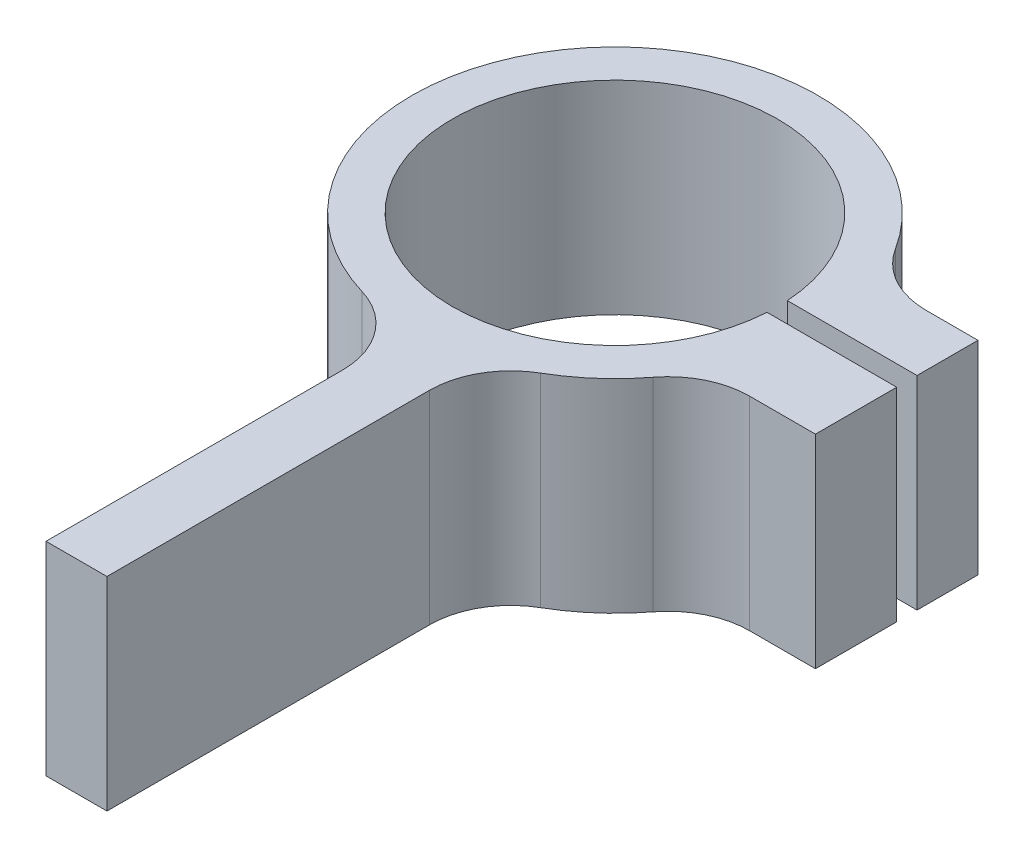
ISO-10303-21;
HEADER;
FILE_DESCRIPTION(('STEP AP214'),'2;1');
FILE_NAME('part.step','',(''),(''),'','','');
FILE_SCHEMA(('AUTOMOTIVE_DESIGN { 1 0 10303 214 1 1 1 1 }'));
ENDSEC;
DATA;
#1=APPLICATION_CONTEXT('core data for automotive mechanical design processes');
#2=APPLICATION_PROTOCOL_DEFINITION('international standard','automotive_design',2000,#1);
#3=PRODUCT_CONTEXT('',#1,'mechanical');
#4=PRODUCT('Part','Part','',(#3));
#5=PRODUCT_RELATED_PRODUCT_CATEGORY('part','',(#4));
#6=PRODUCT_DEFINITION_FORMATION('','',#4);
#7=PRODUCT_DEFINITION_CONTEXT('part definition',#1,'design');
#8=PRODUCT_DEFINITION('design','',#6,#7);
#9=PRODUCT_DEFINITION_SHAPE('','',#8);
#10=(LENGTH_UNIT() NAMED_UNIT(*) SI_UNIT(.MILLI.,.METRE.));
#11=(NAMED_UNIT(*) PLANE_ANGLE_UNIT() SI_UNIT($,.RADIAN.));
#12=(NAMED_UNIT(*) SI_UNIT($,.STERADIAN.) SOLID_ANGLE_UNIT());
#13=UNCERTAINTY_MEASURE_WITH_UNIT(LENGTH_MEASURE(1.E-05),#10,'distance_accuracy_value','');
#14=(GEOMETRIC_REPRESENTATION_CONTEXT(3) GLOBAL_UNCERTAINTY_ASSIGNED_CONTEXT((#13)) GLOBAL_UNIT_ASSIGNED_CONTEXT((#10,
#11,#12)) REPRESENTATION_CONTEXT('',''));
#15=CARTESIAN_POINT('',(0.,0.,0.));
#16=DIRECTION('',(0.,0.,1.));
#17=DIRECTION('',(1.,0.,0.));
#18=AXIS2_PLACEMENT_3D('',#15,#16,#17);
#19=CARTESIAN_POINT('',(14.3674969975976,10.,0.5));
#20=DIRECTION('',(-1.,0.,0.));
#21=DIRECTION('',(0.,0.,1.));
#22=AXIS2_PLACEMENT_3D('',#19,#20,#21);
#23=PLANE('',#22);
#24=DIRECTION('',(0.,0.,-1.));
#25=VECTOR('',#24,1.);
#26=CARTESIAN_POINT('',(14.3674969975976,0.,0.5));
#27=LINE('',#26,#25);
#28=CARTESIAN_POINT('',(14.3674969975976,0.,4.5));
#29=VERTEX_POINT('',#28);
#30=CARTESIAN_POINT('',(14.3674969975976,0.,0.5));
#31=VERTEX_POINT('',#30);
#32=EDGE_CURVE('E168',#29,#31,#27,.T.);
#33=ORIENTED_EDGE('',*,*,#32,.T.);
#34=DIRECTION('',(0.,-1.,0.));
#35=VECTOR('',#34,1.);
#36=CARTESIAN_POINT('',(14.3674969975976,10.,0.5));
#37=LINE('',#36,#35);
#38=CARTESIAN_POINT('',(14.3674969975976,10.,0.5));
#39=VERTEX_POINT('',#38);
#40=EDGE_CURVE('E150',#39,#31,#37,.T.);
#41=ORIENTED_EDGE('',*,*,#40,.F.);
#42=DIRECTION('',(0.,0.,-1.));
#43=VECTOR('',#42,1.);
#44=CARTESIAN_POINT('',(14.3674969975976,10.,0.5));
#45=LINE('',#44,#43);
#46=CARTESIAN_POINT('',(14.3674969975976,10.,4.5));
#47=VERTEX_POINT('',#46);
#48=EDGE_CURVE('E156',#47,#39,#45,.T.);
#49=ORIENTED_EDGE('',*,*,#48,.F.);
#50=DIRECTION('',(0.,-1.,0.));
#51=VECTOR('',#50,1.);
#52=CARTESIAN_POINT('',(14.3674969975976,10.,4.5));
#53=LINE('',#52,#51);
#54=EDGE_CURVE('E240',#47,#29,#53,.T.);
#55=ORIENTED_EDGE('',*,*,#54,.T.);
#56=EDGE_LOOP('',(#33,#41,#49,#55));
#57=FACE_BOUND('',#56,.T.);
#58=ADVANCED_FACE('F34',(#57),#23,.F.);
#59=CARTESIAN_POINT('',(7.98435971133566,10.,0.5));
#60=DIRECTION('',(0.,0.,1.));
#61=DIRECTION('',(1.,0.,0.));
#62=AXIS2_PLACEMENT_3D('',#59,#60,#61);
#63=PLANE('',#62);
#64=DIRECTION('',(-1.,0.,0.));
#65=VECTOR('',#64,1.);
#66=CARTESIAN_POINT('',(7.98435971133566,0.,0.5));
#67=LINE('',#66,#65);
#68=CARTESIAN_POINT('',(7.98435971133566,0.,0.5));
#69=VERTEX_POINT('',#68);
#70=EDGE_CURVE('E242',#31,#69,#67,.T.);
#71=ORIENTED_EDGE('',*,*,#70,.T.);
#72=DIRECTION('',(0.,-1.,0.));
#73=VECTOR('',#72,1.);
#74=CARTESIAN_POINT('',(7.98435971133566,10.,0.5));
#75=LINE('',#74,#73);
#76=CARTESIAN_POINT('',(7.98435971133566,10.,0.5));
#77=VERTEX_POINT('',#76);
#78=EDGE_CURVE('E153',#77,#69,#75,.T.);
#79=ORIENTED_EDGE('',*,*,#78,.F.);
#80=DIRECTION('',(-1.,0.,0.));
#81=VECTOR('',#80,1.);
#82=CARTESIAN_POINT('',(9.98749217771909,10.,0.5));
#83=LINE('',#82,#81);
#84=EDGE_CURVE('E146',#39,#77,#83,.T.);
#85=ORIENTED_EDGE('',*,*,#84,.F.);
#86=ORIENTED_EDGE('',*,*,#40,.T.);
#87=EDGE_LOOP('',(#71,#79,#85,#86));
#88=FACE_BOUND('',#87,.T.);
#89=ADVANCED_FACE('F148',(#88),#63,.F.);
#90=CARTESIAN_POINT('',(0.,10.,0.));
#91=DIRECTION('',(0.,-1.,0.));
#92=DIRECTION('',(0.,0.,-1.));
#93=AXIS2_PLACEMENT_3D('',#90,#91,#92);
#94=CYLINDRICAL_SURFACE('',#93,8.);
#95=CARTESIAN_POINT('',(0.,0.,0.));
#96=DIRECTION('',(0.,-1.,0.));
#97=DIRECTION('',(0.,0.,1.));
#98=AXIS2_PLACEMENT_3D('',#95,#96,#97);
#99=CIRCLE('',#98,8.);
#100=CARTESIAN_POINT('',(7.98435971133566,0.,-0.5));
#101=VERTEX_POINT('',#100);
#102=EDGE_CURVE('E244',#69,#101,#99,.T.);
#103=ORIENTED_EDGE('',*,*,#102,.T.);
#104=DIRECTION('',(0.,-1.,0.));
#105=VECTOR('',#104,1.);
#106=CARTESIAN_POINT('',(7.98435971133566,10.,-0.5));
#107=LINE('',#106,#105);
#108=CARTESIAN_POINT('',(7.98435971133566,10.,-0.5));
#109=VERTEX_POINT('',#108);
#110=EDGE_CURVE('E173',#109,#101,#107,.T.);
#111=ORIENTED_EDGE('',*,*,#110,.F.);
#112=CARTESIAN_POINT('',(0.,10.,0.));
#113=DIRECTION('',(0.,-1.,0.));
#114=DIRECTION('',(0.,0.,1.));
#115=AXIS2_PLACEMENT_3D('',#112,#113,#114);
#116=CIRCLE('',#115,8.);
#117=EDGE_CURVE('E155',#77,#109,#116,.T.);
#118=ORIENTED_EDGE('',*,*,#117,.F.);
#119=ORIENTED_EDGE('',*,*,#78,.T.);
#120=EDGE_LOOP('',(#103,#111,#118,#119));
#121=FACE_BOUND('',#120,.T.);
#122=ADVANCED_FACE('F281',(#121),#94,.F.);
#123=CARTESIAN_POINT('',(9.98749217771909,10.,-0.5));
#124=DIRECTION('',(0.,0.,-1.));
#125=DIRECTION('',(-1.,0.,0.));
#126=AXIS2_PLACEMENT_3D('',#123,#124,#125);
#127=PLANE('',#126);
#128=DIRECTION('',(1.,0.,0.));
#129=VECTOR('',#128,1.);
#130=CARTESIAN_POINT('',(9.98749217771909,0.,-0.5));
#131=LINE('',#130,#129);
#132=CARTESIAN_POINT('',(14.3674969975976,0.,-0.5));
#133=VERTEX_POINT('',#132);
#134=EDGE_CURVE('E247',#101,#133,#131,.T.);
#135=ORIENTED_EDGE('',*,*,#134,.T.);
#136=DIRECTION('',(0.,-1.,0.));
#137=VECTOR('',#136,1.);
#138=CARTESIAN_POINT('',(14.3674969975976,10.,-0.5));
#139=LINE('',#138,#137);
#140=CARTESIAN_POINT('',(14.3674969975976,10.,-0.5));
#141=VERTEX_POINT('',#140);
#142=EDGE_CURVE('E271',#141,#133,#139,.T.);
#143=ORIENTED_EDGE('',*,*,#142,.F.);
#144=DIRECTION('',(1.,0.,0.));
#145=VECTOR('',#144,1.);
#146=CARTESIAN_POINT('',(7.98435971133566,10.,-0.5));
#147=LINE('',#146,#145);
#148=EDGE_CURVE('E279',#109,#141,#147,.T.);
#149=ORIENTED_EDGE('',*,*,#148,.F.);
#150=ORIENTED_EDGE('',*,*,#110,.T.);
#151=EDGE_LOOP('',(#135,#143,#149,#150));
#152=FACE_BOUND('',#151,.T.);
#153=ADVANCED_FACE('F277',(#152),#127,.F.);
#154=CARTESIAN_POINT('',(14.3674969975976,10.,-0.5));
#155=DIRECTION('',(-1.,0.,0.));
#156=DIRECTION('',(0.,0.,1.));
#157=AXIS2_PLACEMENT_3D('',#154,#155,#156);
#158=PLANE('',#157);
#159=DIRECTION('',(0.,0.,-1.));
#160=VECTOR('',#159,1.);
#161=CARTESIAN_POINT('',(14.3674969975976,0.,-0.5));
#162=LINE('',#161,#160);
#163=CARTESIAN_POINT('',(14.3674969975976,0.,-3.5));
#164=VERTEX_POINT('',#163);
#165=EDGE_CURVE('E249',#133,#164,#162,.T.);
#166=ORIENTED_EDGE('',*,*,#165,.T.);
#167=DIRECTION('',(0.,-1.,0.));
#168=VECTOR('',#167,1.);
#169=CARTESIAN_POINT('',(14.3674969975976,10.,-3.5));
#170=LINE('',#169,#168);
#171=CARTESIAN_POINT('',(14.3674969975976,10.,-3.5));
#172=VERTEX_POINT('',#171);
#173=EDGE_CURVE('E268',#172,#164,#170,.T.);
#174=ORIENTED_EDGE('',*,*,#173,.F.);
#175=DIRECTION('',(0.,0.,-1.));
#176=VECTOR('',#175,1.);
#177=CARTESIAN_POINT('',(14.3674969975976,10.,-0.5));
#178=LINE('',#177,#176);
#179=EDGE_CURVE('E295',#141,#172,#178,.T.);
#180=ORIENTED_EDGE('',*,*,#179,.F.);
#181=ORIENTED_EDGE('',*,*,#142,.T.);
#182=EDGE_LOOP('',(#166,#174,#180,#181));
#183=FACE_BOUND('',#182,.T.);
#184=ADVANCED_FACE('F287',(#183),#158,.F.);
#185=CARTESIAN_POINT('',(14.3674969975976,10.,-3.5));
#186=DIRECTION('',(0.,0.,1.));
#187=DIRECTION('',(1.,0.,0.));
#188=AXIS2_PLACEMENT_3D('',#185,#186,#187);
#189=PLANE('',#188);
#190=DIRECTION('',(-1.,0.,0.));
#191=VECTOR('',#190,1.);
#192=CARTESIAN_POINT('',(14.3674969975976,0.,-3.5));
#193=LINE('',#192,#191);
#194=CARTESIAN_POINT('',(11.8215904175369,0.,-3.5));
#195=VERTEX_POINT('',#194);
#196=EDGE_CURVE('E216',#164,#195,#193,.T.);
#197=ORIENTED_EDGE('',*,*,#196,.T.);
#198=DIRECTION('',(0.,1.,0.));
#199=VECTOR('',#198,1.);
#200=CARTESIAN_POINT('',(11.8215904175369,10.,-3.5));
#201=LINE('',#200,#199);
#202=CARTESIAN_POINT('',(11.8215904175369,10.,-3.5));
#203=VERTEX_POINT('',#202);
#204=EDGE_CURVE('E179',#195,#203,#201,.T.);
#205=ORIENTED_EDGE('',*,*,#204,.T.);
#206=DIRECTION('',(-1.,0.,0.));
#207=VECTOR('',#206,1.);
#208=CARTESIAN_POINT('',(14.3674969975976,10.,-3.5));
#209=LINE('',#208,#207);
#210=EDGE_CURVE('E230',#172,#203,#209,.T.);
#211=ORIENTED_EDGE('',*,*,#210,.F.);
#212=ORIENTED_EDGE('',*,*,#173,.T.);
#213=EDGE_LOOP('',(#197,#205,#211,#212));
#214=FACE_BOUND('',#213,.T.);
#215=ADVANCED_FACE('F291',(#214),#189,.F.);
#216=CARTESIAN_POINT('',(0.,10.,0.));
#217=DIRECTION('',(0.,-1.,0.));
#218=DIRECTION('',(0.,0.,-1.));
#219=AXIS2_PLACEMENT_3D('',#216,#217,#218);
#220=CYLINDRICAL_SURFACE('',#219,10.);
#221=CARTESIAN_POINT('',(0.,10.,0.));
#222=DIRECTION('',(0.,1.,0.));
#223=DIRECTION('',(0.,0.,1.));
#224=AXIS2_PLACEMENT_3D('',#221,#222,#223);
#225=CIRCLE('',#224,10.);
#226=CARTESIAN_POINT('',(8.44399315538349,10.,-5.35714285714286));
#227=VERTEX_POINT('',#226);
#228=CARTESIAN_POINT('',(-2.85714285714286,10.,9.5831484749991));
#229=VERTEX_POINT('',#228);
#230=EDGE_CURVE('E226',#227,#229,#225,.T.);
#231=ORIENTED_EDGE('',*,*,#230,.F.);
#232=DIRECTION('',(0.,-1.,0.));
#233=VECTOR('',#232,1.);
#234=CARTESIAN_POINT('',(8.44399315538349,10.,-5.35714285714286));
#235=LINE('',#234,#233);
#236=CARTESIAN_POINT('',(8.44399315538349,0.,-5.35714285714286));
#237=VERTEX_POINT('',#236);
#238=EDGE_CURVE('E171',#227,#237,#235,.T.);
#239=ORIENTED_EDGE('',*,*,#238,.T.);
#240=CARTESIAN_POINT('',(0.,0.,0.));
#241=DIRECTION('',(0.,1.,0.));
#242=DIRECTION('',(0.,0.,1.));
#243=AXIS2_PLACEMENT_3D('',#240,#241,#242);
#244=CIRCLE('',#243,10.);
#245=CARTESIAN_POINT('',(-2.85714285714286,0.,9.5831484749991));
#246=VERTEX_POINT('',#245);
#247=EDGE_CURVE('E209',#237,#246,#244,.T.);
#248=ORIENTED_EDGE('',*,*,#247,.T.);
#249=DIRECTION('',(0.,-1.,0.));
#250=VECTOR('',#249,1.);
#251=CARTESIAN_POINT('',(-2.85714285714286,10.,9.5831484749991));
#252=LINE('',#251,#250);
#253=EDGE_CURVE('E169',#246,#229,#252,.F.);
#254=ORIENTED_EDGE('',*,*,#253,.T.);
#255=EDGE_LOOP('',(#231,#239,#248,#254));
#256=FACE_BOUND('',#255,.T.);
#257=ADVANCED_FACE('F214',(#256),#220,.T.);
#258=CARTESIAN_POINT('',(0.,10.,10.));
#259=DIRECTION('',(1.,0.,0.));
#260=DIRECTION('',(0.,0.,-1.));
#261=AXIS2_PLACEMENT_3D('',#258,#259,#260);
#262=PLANE('',#261);
#263=DIRECTION('',(0.,0.,1.));
#264=VECTOR('',#263,1.);
#265=CARTESIAN_POINT('',(0.,10.,10.));
#266=LINE('',#265,#264);
#267=CARTESIAN_POINT('',(0.,10.,13.4164078649987));
#268=VERTEX_POINT('',#267);
#269=CARTESIAN_POINT('',(0.,10.,28.));
#270=VERTEX_POINT('',#269);
#271=EDGE_CURVE('E222',#268,#270,#266,.T.);
#272=ORIENTED_EDGE('',*,*,#271,.F.);
#273=DIRECTION('',(0.,1.,0.));
#274=VECTOR('',#273,1.);
#275=CARTESIAN_POINT('',(0.,0.,13.4164078649987));
#276=LINE('',#275,#274);
#277=CARTESIAN_POINT('',(0.,0.,13.4164078649987));
#278=VERTEX_POINT('',#277);
#279=EDGE_CURVE('E191',#268,#278,#276,.F.);
#280=ORIENTED_EDGE('',*,*,#279,.T.);
#281=DIRECTION('',(0.,0.,1.));
#282=VECTOR('',#281,1.);
#283=CARTESIAN_POINT('',(0.,0.,10.));
#284=LINE('',#283,#282);
#285=CARTESIAN_POINT('',(0.,0.,28.));
#286=VERTEX_POINT('',#285);
#287=EDGE_CURVE('E211',#278,#286,#284,.T.);
#288=ORIENTED_EDGE('',*,*,#287,.T.);
#289=DIRECTION('',(0.,-1.,0.));
#290=VECTOR('',#289,1.);
#291=CARTESIAN_POINT('',(0.,10.,28.));
#292=LINE('',#291,#290);
#293=EDGE_CURVE('E223',#270,#286,#292,.T.);
#294=ORIENTED_EDGE('',*,*,#293,.F.);
#295=EDGE_LOOP('',(#272,#280,#288,#294));
#296=FACE_BOUND('',#295,.T.);
#297=ADVANCED_FACE('F219',(#296),#262,.F.);
#298=CARTESIAN_POINT('',(0.,10.,28.));
#299=DIRECTION('',(0.,0.,-1.));
#300=DIRECTION('',(-1.,0.,0.));
#301=AXIS2_PLACEMENT_3D('',#298,#299,#300);
#302=PLANE('',#301);
#303=DIRECTION('',(1.,0.,0.));
#304=VECTOR('',#303,1.);
#305=CARTESIAN_POINT('',(0.,0.,28.));
#306=LINE('',#305,#304);
#307=CARTESIAN_POINT('',(3.,0.,28.));
#308=VERTEX_POINT('',#307);
#309=EDGE_CURVE('E254',#286,#308,#306,.T.);
#310=ORIENTED_EDGE('',*,*,#309,.T.);
#311=DIRECTION('',(0.,-1.,0.));
#312=VECTOR('',#311,1.);
#313=CARTESIAN_POINT('',(3.,10.,28.));
#314=LINE('',#313,#312);
#315=CARTESIAN_POINT('',(3.,10.,28.));
#316=VERTEX_POINT('',#315);
#317=EDGE_CURVE('E264',#316,#308,#314,.T.);
#318=ORIENTED_EDGE('',*,*,#317,.F.);
#319=DIRECTION('',(1.,0.,0.));
#320=VECTOR('',#319,1.);
#321=CARTESIAN_POINT('',(0.,10.,28.));
#322=LINE('',#321,#320);
#323=EDGE_CURVE('E225',#270,#316,#322,.T.);
#324=ORIENTED_EDGE('',*,*,#323,.F.);
#325=ORIENTED_EDGE('',*,*,#293,.T.);
#326=EDGE_LOOP('',(#310,#318,#324,#325));
#327=FACE_BOUND('',#326,.T.);
#328=ADVANCED_FACE('F332',(#327),#302,.F.);
#329=CARTESIAN_POINT('',(3.,10.,28.));
#330=DIRECTION('',(-1.,0.,0.));
#331=DIRECTION('',(0.,0.,1.));
#332=AXIS2_PLACEMENT_3D('',#329,#330,#331);
#333=PLANE('',#332);
#334=DIRECTION('',(0.,0.,-1.));
#335=VECTOR('',#334,1.);
#336=CARTESIAN_POINT('',(3.,0.,28.));
#337=LINE('',#336,#335);
#338=CARTESIAN_POINT('',(3.,0.,12.1243556529821));
#339=VERTEX_POINT('',#338);
#340=EDGE_CURVE('E256',#308,#339,#337,.T.);
#341=ORIENTED_EDGE('',*,*,#340,.T.);
#342=DIRECTION('',(0.,1.,0.));
#343=VECTOR('',#342,1.);
#344=CARTESIAN_POINT('',(3.,10.,12.1243556529821));
#345=LINE('',#344,#343);
#346=CARTESIAN_POINT('',(3.,10.,12.1243556529821));
#347=VERTEX_POINT('',#346);
#348=EDGE_CURVE('E189',#339,#347,#345,.T.);
#349=ORIENTED_EDGE('',*,*,#348,.T.);
#350=DIRECTION('',(0.,0.,-1.));
#351=VECTOR('',#350,1.);
#352=CARTESIAN_POINT('',(3.,10.,28.));
#353=LINE('',#352,#351);
#354=EDGE_CURVE('E228',#316,#347,#353,.T.);
#355=ORIENTED_EDGE('',*,*,#354,.F.);
#356=ORIENTED_EDGE('',*,*,#317,.T.);
#357=EDGE_LOOP('',(#341,#349,#355,#356));
#358=FACE_BOUND('',#357,.T.);
#359=ADVANCED_FACE('F335',(#358),#333,.F.);
#360=CARTESIAN_POINT('',(0.,10.,0.));
#361=DIRECTION('',(0.,-1.,0.));
#362=DIRECTION('',(0.,0.,-1.));
#363=AXIS2_PLACEMENT_3D('',#360,#361,#362);
#364=CYLINDRICAL_SURFACE('',#363,10.);
#365=CARTESIAN_POINT('',(0.,0.,0.));
#366=DIRECTION('',(0.,1.,0.));
#367=DIRECTION('',(0.,0.,1.));
#368=AXIS2_PLACEMENT_3D('',#365,#366,#367);
#369=CIRCLE('',#368,10.);
#370=CARTESIAN_POINT('',(5.,0.,8.66025403784438));
#371=VERTEX_POINT('',#370);
#372=CARTESIAN_POINT('',(7.94592695045964,0.,6.07142857142857));
#373=VERTEX_POINT('',#372);
#374=EDGE_CURVE('E259',#371,#373,#369,.T.);
#375=ORIENTED_EDGE('',*,*,#374,.T.);
#376=DIRECTION('',(0.,-1.,0.));
#377=VECTOR('',#376,1.);
#378=CARTESIAN_POINT('',(7.94592695045964,10.,6.07142857142857));
#379=LINE('',#378,#377);
#380=CARTESIAN_POINT('',(7.94592695045964,10.,6.07142857142857));
#381=VERTEX_POINT('',#380);
#382=EDGE_CURVE('E187',#373,#381,#379,.F.);
#383=ORIENTED_EDGE('',*,*,#382,.T.);
#384=CARTESIAN_POINT('',(0.,10.,0.));
#385=DIRECTION('',(0.,1.,0.));
#386=DIRECTION('',(0.,0.,1.));
#387=AXIS2_PLACEMENT_3D('',#384,#385,#386);
#388=CIRCLE('',#387,10.);
#389=CARTESIAN_POINT('',(5.,10.,8.66025403784438));
#390=VERTEX_POINT('',#389);
#391=EDGE_CURVE('E236',#390,#381,#388,.T.);
#392=ORIENTED_EDGE('',*,*,#391,.F.);
#393=DIRECTION('',(0.,-1.,0.));
#394=VECTOR('',#393,1.);
#395=CARTESIAN_POINT('',(5.,10.,8.66025403784439));
#396=LINE('',#395,#394);
#397=EDGE_CURVE('E184',#390,#371,#396,.T.);
#398=ORIENTED_EDGE('',*,*,#397,.T.);
#399=EDGE_LOOP('',(#375,#383,#392,#398));
#400=FACE_BOUND('',#399,.T.);
#401=ADVANCED_FACE('F339',(#400),#364,.T.);
#402=CARTESIAN_POINT('',(14.3674969975976,10.,4.5));
#403=DIRECTION('',(0.,0.,-1.));
#404=DIRECTION('',(-1.,0.,0.));
#405=AXIS2_PLACEMENT_3D('',#402,#403,#404);
#406=PLANE('',#405);
#407=DIRECTION('',(1.,0.,0.));
#408=VECTOR('',#407,1.);
#409=CARTESIAN_POINT('',(14.3674969975976,10.,4.5));
#410=LINE('',#409,#408);
#411=CARTESIAN_POINT('',(11.1242977306435,10.,4.5));
#412=VERTEX_POINT('',#411);
#413=EDGE_CURVE('E161',#412,#47,#410,.T.);
#414=ORIENTED_EDGE('',*,*,#413,.F.);
#415=DIRECTION('',(0.,1.,0.));
#416=VECTOR('',#415,1.);
#417=CARTESIAN_POINT('',(11.1242977306435,0.,4.5));
#418=LINE('',#417,#416);
#419=CARTESIAN_POINT('',(11.1242977306435,0.,4.5));
#420=VERTEX_POINT('',#419);
#421=EDGE_CURVE('E181',#412,#420,#418,.F.);
#422=ORIENTED_EDGE('',*,*,#421,.T.);
#423=DIRECTION('',(1.,0.,0.));
#424=VECTOR('',#423,1.);
#425=CARTESIAN_POINT('',(14.3674969975976,0.,4.5));
#426=LINE('',#425,#424);
#427=EDGE_CURVE('E165',#420,#29,#426,.T.);
#428=ORIENTED_EDGE('',*,*,#427,.T.);
#429=ORIENTED_EDGE('',*,*,#54,.F.);
#430=EDGE_LOOP('',(#414,#422,#428,#429));
#431=FACE_BOUND('',#430,.T.);
#432=ADVANCED_FACE('F343',(#431),#406,.F.);
#433=CARTESIAN_POINT('',(0.,10.,0.));
#434=DIRECTION('',(0.,1.,0.));
#435=DIRECTION('',(0.,0.,1.));
#436=AXIS2_PLACEMENT_3D('',#433,#434,#435);
#437=PLANE('',#436);
#438=ORIENTED_EDGE('',*,*,#48,.T.);
#439=ORIENTED_EDGE('',*,*,#84,.T.);
#440=ORIENTED_EDGE('',*,*,#117,.T.);
#441=ORIENTED_EDGE('',*,*,#148,.T.);
#442=ORIENTED_EDGE('',*,*,#179,.T.);
#443=ORIENTED_EDGE('',*,*,#210,.T.);
#444=CARTESIAN_POINT('',(11.8215904175369,10.,-7.5));
#445=DIRECTION('',(0.,1.,0.));
#446=DIRECTION('',(0.,0.,1.));
#447=AXIS2_PLACEMENT_3D('',#444,#445,#446);
#448=CIRCLE('',#447,4.);
#449=EDGE_CURVE('E195',#203,#227,#448,.F.);
#450=ORIENTED_EDGE('',*,*,#449,.T.);
#451=ORIENTED_EDGE('',*,*,#230,.T.);
#452=CARTESIAN_POINT('',(-4.,10.,13.4164078649987));
#453=DIRECTION('',(0.,1.,0.));
#454=DIRECTION('',(0.,0.,1.));
#455=AXIS2_PLACEMENT_3D('',#452,#453,#454);
#456=CIRCLE('',#455,4.);
#457=EDGE_CURVE('E11',#229,#268,#456,.F.);
#458=ORIENTED_EDGE('',*,*,#457,.T.);
#459=ORIENTED_EDGE('',*,*,#271,.T.);
#460=ORIENTED_EDGE('',*,*,#323,.T.);
#461=ORIENTED_EDGE('',*,*,#354,.T.);
#462=CARTESIAN_POINT('',(7.,10.,12.1243556529821));
#463=DIRECTION('',(0.,1.,0.));
#464=DIRECTION('',(0.,0.,1.));
#465=AXIS2_PLACEMENT_3D('',#462,#463,#464);
#466=CIRCLE('',#465,4.);
#467=EDGE_CURVE('E203',#347,#390,#466,.F.);
#468=ORIENTED_EDGE('',*,*,#467,.T.);
#469=ORIENTED_EDGE('',*,*,#391,.T.);
#470=CARTESIAN_POINT('',(11.1242977306435,10.,8.5));
#471=DIRECTION('',(0.,1.,0.));
#472=DIRECTION('',(0.,0.,1.));
#473=AXIS2_PLACEMENT_3D('',#470,#471,#472);
#474=CIRCLE('',#473,4.);
#475=EDGE_CURVE('E199',#381,#412,#474,.F.);
#476=ORIENTED_EDGE('',*,*,#475,.T.);
#477=ORIENTED_EDGE('',*,*,#413,.T.);
#478=EDGE_LOOP('',(#438,#439,#440,#441,#442,#443,#450,#451,#458,#459,#460,#461,#468,#469,#476,#477));
#479=FACE_BOUND('',#478,.T.);
#480=ADVANCED_FACE('F159',(#479),#437,.T.);
#481=CARTESIAN_POINT('',(0.,0.,0.));
#482=DIRECTION('',(0.,1.,0.));
#483=DIRECTION('',(0.,0.,1.));
#484=AXIS2_PLACEMENT_3D('',#481,#482,#483);
#485=PLANE('',#484);
#486=ORIENTED_EDGE('',*,*,#32,.F.);
#487=ORIENTED_EDGE('',*,*,#427,.F.);
#488=CARTESIAN_POINT('',(11.1242977306435,0.,8.5));
#489=DIRECTION('',(0.,1.,0.));
#490=DIRECTION('',(0.,0.,1.));
#491=AXIS2_PLACEMENT_3D('',#488,#489,#490);
#492=CIRCLE('',#491,4.);
#493=EDGE_CURVE('E197',#420,#373,#492,.T.);
#494=ORIENTED_EDGE('',*,*,#493,.T.);
#495=ORIENTED_EDGE('',*,*,#374,.F.);
#496=CARTESIAN_POINT('',(7.,0.,12.1243556529821));
#497=DIRECTION('',(0.,1.,0.));
#498=DIRECTION('',(0.,0.,1.));
#499=AXIS2_PLACEMENT_3D('',#496,#497,#498);
#500=CIRCLE('',#499,4.);
#501=EDGE_CURVE('E201',#371,#339,#500,.T.);
#502=ORIENTED_EDGE('',*,*,#501,.T.);
#503=ORIENTED_EDGE('',*,*,#340,.F.);
#504=ORIENTED_EDGE('',*,*,#309,.F.);
#505=ORIENTED_EDGE('',*,*,#287,.F.);
#506=CARTESIAN_POINT('',(-4.,0.,13.4164078649987));
#507=DIRECTION('',(0.,1.,0.));
#508=DIRECTION('',(0.,0.,1.));
#509=AXIS2_PLACEMENT_3D('',#506,#507,#508);
#510=CIRCLE('',#509,4.);
#511=EDGE_CURVE('E42',#278,#246,#510,.T.);
#512=ORIENTED_EDGE('',*,*,#511,.T.);
#513=ORIENTED_EDGE('',*,*,#247,.F.);
#514=CARTESIAN_POINT('',(11.8215904175369,0.,-7.5));
#515=DIRECTION('',(0.,1.,0.));
#516=DIRECTION('',(0.,0.,1.));
#517=AXIS2_PLACEMENT_3D('',#514,#515,#516);
#518=CIRCLE('',#517,4.);
#519=EDGE_CURVE('E193',#237,#195,#518,.T.);
#520=ORIENTED_EDGE('',*,*,#519,.T.);
#521=ORIENTED_EDGE('',*,*,#196,.F.);
#522=ORIENTED_EDGE('',*,*,#165,.F.);
#523=ORIENTED_EDGE('',*,*,#134,.F.);
#524=ORIENTED_EDGE('',*,*,#102,.F.);
#525=ORIENTED_EDGE('',*,*,#70,.F.);
#526=EDGE_LOOP('',(#486,#487,#494,#495,#502,#503,#504,#505,#512,#513,#520,#521,#522,#523,#524,#525));
#527=FACE_BOUND('',#526,.T.);
#528=ADVANCED_FACE('F208',(#527),#485,.F.);
#529=CARTESIAN_POINT('',(11.8215904175369,10.,-7.5));
#530=DIRECTION('',(0.,-1.,0.));
#531=DIRECTION('',(0.,0.,-1.));
#532=AXIS2_PLACEMENT_3D('',#529,#530,#531);
#533=CYLINDRICAL_SURFACE('',#532,4.);
#534=ORIENTED_EDGE('',*,*,#449,.F.);
#535=ORIENTED_EDGE('',*,*,#204,.F.);
#536=ORIENTED_EDGE('',*,*,#519,.F.);
#537=ORIENTED_EDGE('',*,*,#238,.F.);
#538=EDGE_LOOP('',(#534,#535,#536,#537));
#539=FACE_BOUND('',#538,.T.);
#540=ADVANCED_FACE('F300',(#539),#533,.F.);
#541=CARTESIAN_POINT('',(11.1242977306435,10.,8.5));
#542=DIRECTION('',(0.,-1.,0.));
#543=DIRECTION('',(0.,0.,-1.));
#544=AXIS2_PLACEMENT_3D('',#541,#542,#543);
#545=CYLINDRICAL_SURFACE('',#544,4.);
#546=ORIENTED_EDGE('',*,*,#475,.F.);
#547=ORIENTED_EDGE('',*,*,#382,.F.);
#548=ORIENTED_EDGE('',*,*,#493,.F.);
#549=ORIENTED_EDGE('',*,*,#421,.F.);
#550=EDGE_LOOP('',(#546,#547,#548,#549));
#551=FACE_BOUND('',#550,.T.);
#552=ADVANCED_FACE('F302',(#551),#545,.F.);
#553=CARTESIAN_POINT('',(7.,10.,12.1243556529821));
#554=DIRECTION('',(0.,-1.,0.));
#555=DIRECTION('',(0.,0.,-1.));
#556=AXIS2_PLACEMENT_3D('',#553,#554,#555);
#557=CYLINDRICAL_SURFACE('',#556,4.);
#558=ORIENTED_EDGE('',*,*,#467,.F.);
#559=ORIENTED_EDGE('',*,*,#348,.F.);
#560=ORIENTED_EDGE('',*,*,#501,.F.);
#561=ORIENTED_EDGE('',*,*,#397,.F.);
#562=EDGE_LOOP('',(#558,#559,#560,#561));
#563=FACE_BOUND('',#562,.T.);
#564=ADVANCED_FACE('F308',(#563),#557,.F.);
#565=CARTESIAN_POINT('',(-4.,10.,13.4164078649987));
#566=DIRECTION('',(0.,-1.,0.));
#567=DIRECTION('',(0.,0.,-1.));
#568=AXIS2_PLACEMENT_3D('',#565,#566,#567);
#569=CYLINDRICAL_SURFACE('',#568,4.);
#570=ORIENTED_EDGE('',*,*,#457,.F.);
#571=ORIENTED_EDGE('',*,*,#253,.F.);
#572=ORIENTED_EDGE('',*,*,#511,.F.);
#573=ORIENTED_EDGE('',*,*,#279,.F.);
#574=EDGE_LOOP('',(#570,#571,#572,#573));
#575=FACE_BOUND('',#574,.T.);
#576=ADVANCED_FACE('F36',(#575),#569,.F.);
#577=CLOSED_SHELL('',(#58,#89,#122,#153,#184,#215,#257,#297,#328,#359,#401,#432,#480,#528,#540,
#552,#564,#576));
#578=MANIFOLD_SOLID_BREP('B2',#577);
#579=ADVANCED_BREP_SHAPE_REPRESENTATION('',(#18,#578),#14);
#580=SHAPE_DEFINITION_REPRESENTATION(#9,#579);
ENDSEC;
END-ISO-10303-21;
